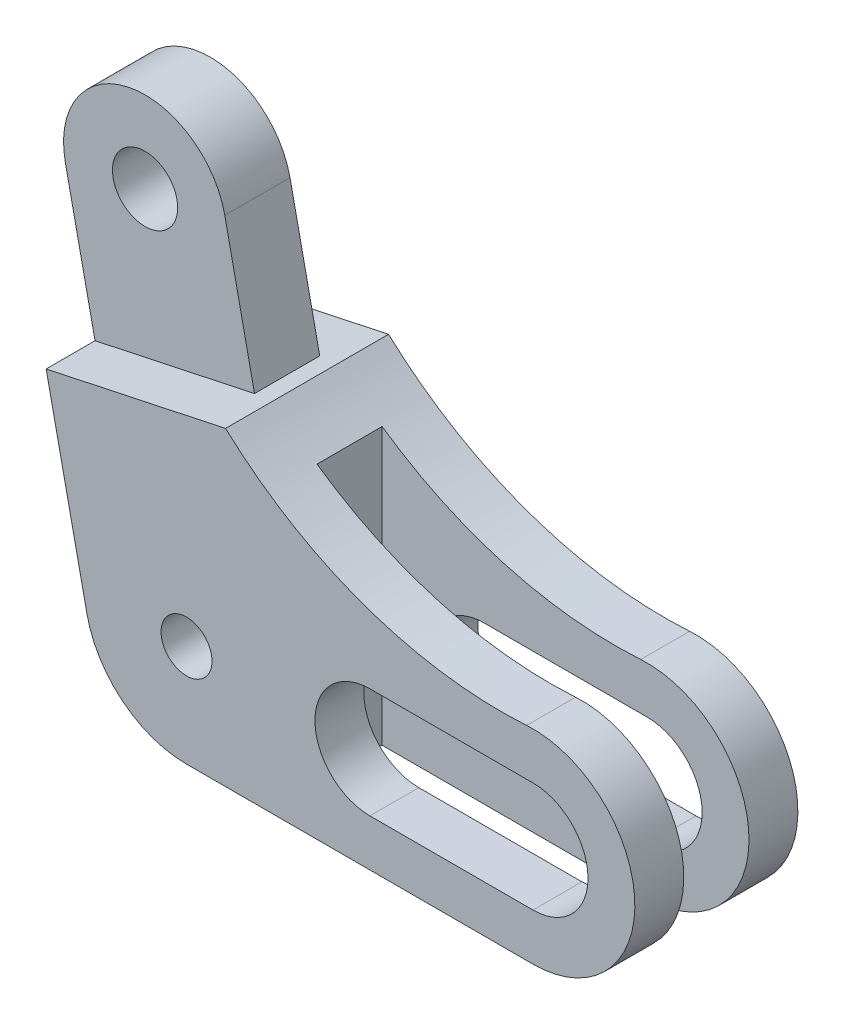
ISO-10303-21;
HEADER;
FILE_DESCRIPTION(('STEP AP214'),'2;1');
FILE_NAME('part.step','',(''),(''),'','','');
FILE_SCHEMA(('AUTOMOTIVE_DESIGN { 1 0 10303 214 1 1 1 1 }'));
ENDSEC;
DATA;
#1=APPLICATION_CONTEXT('core data for automotive mechanical design processes');
#2=APPLICATION_PROTOCOL_DEFINITION('international standard','automotive_design',2000,#1);
#3=PRODUCT_CONTEXT('',#1,'mechanical');
#4=PRODUCT('Part','Part','',(#3));
#5=PRODUCT_RELATED_PRODUCT_CATEGORY('part','',(#4));
#6=PRODUCT_DEFINITION_FORMATION('','',#4);
#7=PRODUCT_DEFINITION_CONTEXT('part definition',#1,'design');
#8=PRODUCT_DEFINITION('design','',#6,#7);
#9=PRODUCT_DEFINITION_SHAPE('','',#8);
#10=(LENGTH_UNIT() NAMED_UNIT(*) SI_UNIT(.MILLI.,.METRE.));
#11=(NAMED_UNIT(*) PLANE_ANGLE_UNIT() SI_UNIT($,.RADIAN.));
#12=(NAMED_UNIT(*) SI_UNIT($,.STERADIAN.) SOLID_ANGLE_UNIT());
#13=UNCERTAINTY_MEASURE_WITH_UNIT(LENGTH_MEASURE(1.E-05),#10,'distance_accuracy_value','');
#14=(GEOMETRIC_REPRESENTATION_CONTEXT(3) GLOBAL_UNCERTAINTY_ASSIGNED_CONTEXT((#13)) GLOBAL_UNIT_ASSIGNED_CONTEXT((#10,
#11,#12)) REPRESENTATION_CONTEXT('',''));
#15=CARTESIAN_POINT('',(0.,0.,0.));
#16=DIRECTION('',(0.,0.,1.));
#17=DIRECTION('',(1.,0.,0.));
#18=AXIS2_PLACEMENT_3D('',#15,#16,#17);
#19=CARTESIAN_POINT('',(85.,0.,20.));
#20=DIRECTION('',(0.,0.,-1.));
#21=DIRECTION('',(-1.,0.,0.));
#22=AXIS2_PLACEMENT_3D('',#19,#20,#21);
#23=CYLINDRICAL_SURFACE('',#22,25.);
#24=CARTESIAN_POINT('',(85.,0.,8.));
#25=DIRECTION('',(0.,0.,1.));
#26=DIRECTION('',(1.,0.,0.));
#27=AXIS2_PLACEMENT_3D('',#24,#25,#26);
#28=CIRCLE('',#27,25.);
#29=CARTESIAN_POINT('',(85.,-25.,8.));
#30=VERTEX_POINT('',#29);
#31=CARTESIAN_POINT('',(83.4431751405397,24.9514788410821,8.));
#32=VERTEX_POINT('',#31);
#33=EDGE_CURVE('E256',#30,#32,#28,.T.);
#34=ORIENTED_EDGE('',*,*,#33,.T.);
#35=DIRECTION('',(0.,0.,-1.));
#36=VECTOR('',#35,1.);
#37=CARTESIAN_POINT('',(83.4431751405397,24.9514788410821,20.));
#38=LINE('',#37,#36);
#39=CARTESIAN_POINT('',(83.4431751405397,24.9514788410821,20.));
#40=VERTEX_POINT('',#39);
#41=EDGE_CURVE('E338',#40,#32,#38,.T.);
#42=ORIENTED_EDGE('',*,*,#41,.F.);
#43=CARTESIAN_POINT('',(85.,0.,20.));
#44=DIRECTION('',(0.,0.,1.));
#45=DIRECTION('',(1.,0.,0.));
#46=AXIS2_PLACEMENT_3D('',#43,#44,#45);
#47=CIRCLE('',#46,25.);
#48=CARTESIAN_POINT('',(85.,-25.,20.));
#49=VERTEX_POINT('',#48);
#50=EDGE_CURVE('E308',#49,#40,#47,.T.);
#51=ORIENTED_EDGE('',*,*,#50,.F.);
#52=DIRECTION('',(0.,0.,-1.));
#53=VECTOR('',#52,1.);
#54=CARTESIAN_POINT('',(85.,-25.,20.));
#55=LINE('',#54,#53);
#56=EDGE_CURVE('E342',#49,#30,#55,.T.);
#57=ORIENTED_EDGE('',*,*,#56,.T.);
#58=EDGE_LOOP('',(#34,#42,#51,#57));
#59=FACE_BOUND('',#58,.T.);
#60=ADVANCED_FACE('F33',(#59),#23,.T.);
#61=CARTESIAN_POINT('',(85.,0.,20.));
#62=DIRECTION('',(0.,0.,-1.));
#63=DIRECTION('',(-1.,0.,0.));
#64=AXIS2_PLACEMENT_3D('',#61,#62,#63);
#65=CYLINDRICAL_SURFACE('',#64,13.5);
#66=CARTESIAN_POINT('',(85.,0.,8.));
#67=DIRECTION('',(0.,0.,1.));
#68=DIRECTION('',(1.,0.,0.));
#69=AXIS2_PLACEMENT_3D('',#66,#67,#68);
#70=CIRCLE('',#69,13.5);
#71=CARTESIAN_POINT('',(85.,-13.5,8.));
#72=VERTEX_POINT('',#71);
#73=CARTESIAN_POINT('',(85.,13.5,8.));
#74=VERTEX_POINT('',#73);
#75=EDGE_CURVE('E251',#72,#74,#70,.T.);
#76=ORIENTED_EDGE('',*,*,#75,.F.);
#77=DIRECTION('',(0.,0.,-1.));
#78=VECTOR('',#77,1.);
#79=CARTESIAN_POINT('',(85.,-13.5,20.));
#80=LINE('',#79,#78);
#81=CARTESIAN_POINT('',(85.,-13.5,20.));
#82=VERTEX_POINT('',#81);
#83=EDGE_CURVE('E286',#82,#72,#80,.T.);
#84=ORIENTED_EDGE('',*,*,#83,.F.);
#85=CARTESIAN_POINT('',(85.,0.,20.));
#86=DIRECTION('',(0.,0.,1.));
#87=DIRECTION('',(1.,0.,0.));
#88=AXIS2_PLACEMENT_3D('',#85,#86,#87);
#89=CIRCLE('',#88,13.5);
#90=CARTESIAN_POINT('',(85.,13.5,20.));
#91=VERTEX_POINT('',#90);
#92=EDGE_CURVE('E265',#82,#91,#89,.T.);
#93=ORIENTED_EDGE('',*,*,#92,.T.);
#94=DIRECTION('',(0.,0.,-1.));
#95=VECTOR('',#94,1.);
#96=CARTESIAN_POINT('',(85.,13.5,20.));
#97=LINE('',#96,#95);
#98=EDGE_CURVE('E298',#91,#74,#97,.T.);
#99=ORIENTED_EDGE('',*,*,#98,.T.);
#100=EDGE_LOOP('',(#76,#84,#93,#99));
#101=FACE_BOUND('',#100,.T.);
#102=ADVANCED_FACE('F359',(#101),#65,.F.);
#103=CARTESIAN_POINT('',(85.,13.5,20.));
#104=DIRECTION('',(0.,-1.,0.));
#105=DIRECTION('',(1.,0.,0.));
#106=AXIS2_PLACEMENT_3D('',#103,#104,#105);
#107=PLANE('',#106);
#108=DIRECTION('',(-1.,0.,0.));
#109=VECTOR('',#108,1.);
#110=CARTESIAN_POINT('',(85.,13.5,8.));
#111=LINE('',#110,#109);
#112=CARTESIAN_POINT('',(45.,13.5,7.99999999999999));
#113=VERTEX_POINT('',#112);
#114=EDGE_CURVE('E249',#74,#113,#111,.T.);
#115=ORIENTED_EDGE('',*,*,#114,.F.);
#116=ORIENTED_EDGE('',*,*,#98,.F.);
#117=DIRECTION('',(-1.,0.,0.));
#118=VECTOR('',#117,1.);
#119=CARTESIAN_POINT('',(85.,13.5,20.));
#120=LINE('',#119,#118);
#121=CARTESIAN_POINT('',(45.,13.5,20.));
#122=VERTEX_POINT('',#121);
#123=EDGE_CURVE('E267',#91,#122,#120,.T.);
#124=ORIENTED_EDGE('',*,*,#123,.T.);
#125=DIRECTION('',(0.,0.,-1.));
#126=VECTOR('',#125,1.);
#127=CARTESIAN_POINT('',(45.,13.5,20.));
#128=LINE('',#127,#126);
#129=EDGE_CURVE('E294',#122,#113,#128,.T.);
#130=ORIENTED_EDGE('',*,*,#129,.T.);
#131=EDGE_LOOP('',(#115,#116,#124,#130));
#132=FACE_BOUND('',#131,.T.);
#133=ADVANCED_FACE('F370',(#132),#107,.T.);
#134=CARTESIAN_POINT('',(45.,0.,20.));
#135=DIRECTION('',(0.,0.,-1.));
#136=DIRECTION('',(-1.,0.,0.));
#137=AXIS2_PLACEMENT_3D('',#134,#135,#136);
#138=CYLINDRICAL_SURFACE('',#137,13.5);
#139=CARTESIAN_POINT('',(45.,0.,7.99999999999999));
#140=DIRECTION('',(0.,0.,1.));
#141=DIRECTION('',(1.,0.,0.));
#142=AXIS2_PLACEMENT_3D('',#139,#140,#141);
#143=CIRCLE('',#142,13.5);
#144=CARTESIAN_POINT('',(45.,-13.5,8.));
#145=VERTEX_POINT('',#144);
#146=EDGE_CURVE('E247',#113,#145,#143,.T.);
#147=ORIENTED_EDGE('',*,*,#146,.F.);
#148=ORIENTED_EDGE('',*,*,#129,.F.);
#149=CARTESIAN_POINT('',(45.,0.,20.));
#150=DIRECTION('',(0.,0.,1.));
#151=DIRECTION('',(1.,0.,0.));
#152=AXIS2_PLACEMENT_3D('',#149,#150,#151);
#153=CIRCLE('',#152,13.5);
#154=CARTESIAN_POINT('',(45.,-13.5,20.));
#155=VERTEX_POINT('',#154);
#156=EDGE_CURVE('E270',#122,#155,#153,.T.);
#157=ORIENTED_EDGE('',*,*,#156,.T.);
#158=DIRECTION('',(0.,0.,-1.));
#159=VECTOR('',#158,1.);
#160=CARTESIAN_POINT('',(45.,-13.5,20.));
#161=LINE('',#160,#159);
#162=EDGE_CURVE('E290',#155,#145,#161,.T.);
#163=ORIENTED_EDGE('',*,*,#162,.T.);
#164=EDGE_LOOP('',(#147,#148,#157,#163));
#165=FACE_BOUND('',#164,.T.);
#166=ADVANCED_FACE('F373',(#165),#138,.F.);
#167=CARTESIAN_POINT('',(85.,-13.5,20.));
#168=DIRECTION('',(0.,1.,0.));
#169=DIRECTION('',(-1.,0.,0.));
#170=AXIS2_PLACEMENT_3D('',#167,#168,#169);
#171=PLANE('',#170);
#172=DIRECTION('',(1.,0.,0.));
#173=VECTOR('',#172,1.);
#174=CARTESIAN_POINT('',(85.,-13.5,8.));
#175=LINE('',#174,#173);
#176=EDGE_CURVE('E41',#145,#72,#175,.T.);
#177=ORIENTED_EDGE('',*,*,#176,.F.);
#178=ORIENTED_EDGE('',*,*,#162,.F.);
#179=DIRECTION('',(1.,0.,0.));
#180=VECTOR('',#179,1.);
#181=CARTESIAN_POINT('',(85.,-13.5,20.));
#182=LINE('',#181,#180);
#183=EDGE_CURVE('E273',#155,#82,#182,.T.);
#184=ORIENTED_EDGE('',*,*,#183,.T.);
#185=ORIENTED_EDGE('',*,*,#83,.T.);
#186=EDGE_LOOP('',(#177,#178,#184,#185));
#187=FACE_BOUND('',#186,.T.);
#188=ADVANCED_FACE('F362',(#187),#171,.T.);
#189=CARTESIAN_POINT('',(0.,0.,20.));
#190=DIRECTION('',(0.,0.,1.));
#191=DIRECTION('',(1.,0.,0.));
#192=AXIS2_PLACEMENT_3D('',#189,#190,#191);
#193=PLANE('',#192);
#194=ORIENTED_EDGE('',*,*,#123,.F.);
#195=ORIENTED_EDGE('',*,*,#92,.F.);
#196=ORIENTED_EDGE('',*,*,#183,.F.);
#197=ORIENTED_EDGE('',*,*,#156,.F.);
#198=EDGE_LOOP('',(#194,#195,#196,#197));
#199=FACE_BOUND('',#198,.T.);
#200=CARTESIAN_POINT('',(0.,0.,20.));
#201=DIRECTION('',(0.,0.,1.));
#202=DIRECTION('',(1.,0.,0.));
#203=AXIS2_PLACEMENT_3D('',#200,#201,#202);
#204=CIRCLE('',#203,25.);
#205=CARTESIAN_POINT('',(-24.4520069263471,-5.20570430142507,20.));
#206=VERTEX_POINT('',#205);
#207=CARTESIAN_POINT('',(0.,-25.,20.));
#208=VERTEX_POINT('',#207);
#209=EDGE_CURVE('E302',#206,#208,#204,.T.);
#210=ORIENTED_EDGE('',*,*,#209,.T.);
#211=DIRECTION('',(1.,0.,0.));
#212=VECTOR('',#211,1.);
#213=CARTESIAN_POINT('',(0.,-25.,20.));
#214=LINE('',#213,#212);
#215=EDGE_CURVE('E305',#208,#49,#214,.T.);
#216=ORIENTED_EDGE('',*,*,#215,.T.);
#217=ORIENTED_EDGE('',*,*,#50,.T.);
#218=CARTESIAN_POINT('',(77.2158757026983,124.75739420541,20.));
#219=DIRECTION('',(0.,0.,-1.));
#220=DIRECTION('',(-1.,0.,0.));
#221=AXIS2_PLACEMENT_3D('',#218,#219,#220);
#222=CIRCLE('',#221,100.);
#223=CARTESIAN_POINT('',(9.56665328234152,51.1124167397264,20.));
#224=VERTEX_POINT('',#223);
#225=EDGE_CURVE('E310',#40,#224,#222,.T.);
#226=ORIENTED_EDGE('',*,*,#225,.T.);
#227=DIRECTION('',(-0.978080277053882,-0.208228172057003,0.));
#228=VECTOR('',#227,1.);
#229=CARTESIAN_POINT('',(9.5666532823415,51.1124167397264,20.));
#230=LINE('',#229,#228);
#231=CARTESIAN_POINT('',(-34.4469591850832,41.7421489971613,20.));
#232=VERTEX_POINT('',#231);
#233=EDGE_CURVE('E312',#224,#232,#230,.T.);
#234=ORIENTED_EDGE('',*,*,#233,.T.);
#235=DIRECTION('',(0.208228172057003,-0.978080277053882,0.));
#236=VECTOR('',#235,1.);
#237=CARTESIAN_POINT('',(-34.4469591850832,41.7421489971613,20.));
#238=LINE('',#237,#236);
#239=EDGE_CURVE('E314',#232,#206,#238,.T.);
#240=ORIENTED_EDGE('',*,*,#239,.T.);
#241=EDGE_LOOP('',(#210,#216,#217,#226,#234,#240));
#242=FACE_BOUND('',#241,.T.);
#243=CARTESIAN_POINT('',(0.,0.,20.));
#244=DIRECTION('',(0.,0.,1.));
#245=DIRECTION('',(1.,0.,0.));
#246=AXIS2_PLACEMENT_3D('',#243,#244,#245);
#247=CIRCLE('',#246,6.25);
#248=CARTESIAN_POINT('',(6.25,0.,20.));
#249=VERTEX_POINT('',#248);
#250=EDGE_CURVE('E259',#249,#249,#247,.T.);
#251=ORIENTED_EDGE('',*,*,#250,.F.);
#252=EDGE_LOOP('',(#251));
#253=FACE_BOUND('',#252,.T.);
#254=ADVANCED_FACE('F367',(#199,#242,#253),#193,.T.);
#255=CARTESIAN_POINT('',(0.,0.,-20.));
#256=DIRECTION('',(0.,0.,1.));
#257=DIRECTION('',(1.,0.,0.));
#258=AXIS2_PLACEMENT_3D('',#255,#256,#257);
#259=PLANE('',#258);
#260=CARTESIAN_POINT('',(0.,0.,-20.));
#261=DIRECTION('',(0.,0.,1.));
#262=DIRECTION('',(1.,0.,0.));
#263=AXIS2_PLACEMENT_3D('',#260,#261,#262);
#264=CIRCLE('',#263,25.);
#265=CARTESIAN_POINT('',(-24.4520069263471,-5.20570430142507,-20.));
#266=VERTEX_POINT('',#265);
#267=CARTESIAN_POINT('',(0.,-25.,-20.));
#268=VERTEX_POINT('',#267);
#269=EDGE_CURVE('E301',#266,#268,#264,.T.);
#270=ORIENTED_EDGE('',*,*,#269,.F.);
#271=DIRECTION('',(0.208228172057003,-0.978080277053882,0.));
#272=VECTOR('',#271,1.);
#273=CARTESIAN_POINT('',(-34.4469591850832,41.7421489971613,-20.));
#274=LINE('',#273,#272);
#275=CARTESIAN_POINT('',(-34.4469591850832,41.7421489971613,-20.));
#276=VERTEX_POINT('',#275);
#277=EDGE_CURVE('E306',#276,#266,#274,.T.);
#278=ORIENTED_EDGE('',*,*,#277,.F.);
#279=DIRECTION('',(-0.978080277053882,-0.208228172057003,0.));
#280=VECTOR('',#279,1.);
#281=CARTESIAN_POINT('',(9.5666532823415,51.1124167397264,-20.));
#282=LINE('',#281,#280);
#283=CARTESIAN_POINT('',(9.56665328234152,51.1124167397264,-20.));
#284=VERTEX_POINT('',#283);
#285=EDGE_CURVE('E327',#284,#276,#282,.T.);
#286=ORIENTED_EDGE('',*,*,#285,.F.);
#287=CARTESIAN_POINT('',(77.2158757026983,124.75739420541,-20.));
#288=DIRECTION('',(0.,0.,-1.));
#289=DIRECTION('',(-1.,0.,0.));
#290=AXIS2_PLACEMENT_3D('',#287,#288,#289);
#291=CIRCLE('',#290,100.);
#292=CARTESIAN_POINT('',(83.4431751405397,24.9514788410821,-20.));
#293=VERTEX_POINT('',#292);
#294=EDGE_CURVE('E325',#293,#284,#291,.T.);
#295=ORIENTED_EDGE('',*,*,#294,.F.);
#296=CARTESIAN_POINT('',(85.,0.,-20.));
#297=DIRECTION('',(0.,0.,1.));
#298=DIRECTION('',(1.,0.,0.));
#299=AXIS2_PLACEMENT_3D('',#296,#297,#298);
#300=CIRCLE('',#299,25.);
#301=CARTESIAN_POINT('',(85.,-25.,-20.));
#302=VERTEX_POINT('',#301);
#303=EDGE_CURVE('E322',#302,#293,#300,.T.);
#304=ORIENTED_EDGE('',*,*,#303,.F.);
#305=DIRECTION('',(1.,0.,0.));
#306=VECTOR('',#305,1.);
#307=CARTESIAN_POINT('',(0.,-25.,-20.));
#308=LINE('',#307,#306);
#309=EDGE_CURVE('E319',#268,#302,#308,.T.);
#310=ORIENTED_EDGE('',*,*,#309,.F.);
#311=EDGE_LOOP('',(#270,#278,#286,#295,#304,#310));
#312=FACE_BOUND('',#311,.T.);
#313=CARTESIAN_POINT('',(85.,0.,-20.));
#314=DIRECTION('',(0.,0.,1.));
#315=DIRECTION('',(1.,0.,0.));
#316=AXIS2_PLACEMENT_3D('',#313,#314,#315);
#317=CIRCLE('',#316,13.5);
#318=CARTESIAN_POINT('',(85.,-13.5,-20.));
#319=VERTEX_POINT('',#318);
#320=CARTESIAN_POINT('',(85.,13.5,-20.));
#321=VERTEX_POINT('',#320);
#322=EDGE_CURVE('E262',#319,#321,#317,.T.);
#323=ORIENTED_EDGE('',*,*,#322,.T.);
#324=DIRECTION('',(-1.,0.,0.));
#325=VECTOR('',#324,1.);
#326=CARTESIAN_POINT('',(85.,13.5,-20.));
#327=LINE('',#326,#325);
#328=CARTESIAN_POINT('',(45.,13.5,-20.));
#329=VERTEX_POINT('',#328);
#330=EDGE_CURVE('E278',#321,#329,#327,.T.);
#331=ORIENTED_EDGE('',*,*,#330,.T.);
#332=CARTESIAN_POINT('',(45.,0.,-20.));
#333=DIRECTION('',(0.,0.,1.));
#334=DIRECTION('',(1.,0.,0.));
#335=AXIS2_PLACEMENT_3D('',#332,#333,#334);
#336=CIRCLE('',#335,13.5);
#337=CARTESIAN_POINT('',(45.,-13.5,-20.));
#338=VERTEX_POINT('',#337);
#339=EDGE_CURVE('E281',#329,#338,#336,.T.);
#340=ORIENTED_EDGE('',*,*,#339,.T.);
#341=DIRECTION('',(1.,0.,0.));
#342=VECTOR('',#341,1.);
#343=CARTESIAN_POINT('',(85.,-13.5,-20.));
#344=LINE('',#343,#342);
#345=EDGE_CURVE('E268',#338,#319,#344,.T.);
#346=ORIENTED_EDGE('',*,*,#345,.T.);
#347=EDGE_LOOP('',(#323,#331,#340,#346));
#348=FACE_BOUND('',#347,.T.);
#349=CARTESIAN_POINT('',(0.,0.,-20.));
#350=DIRECTION('',(0.,0.,1.));
#351=DIRECTION('',(1.,0.,0.));
#352=AXIS2_PLACEMENT_3D('',#349,#350,#351);
#353=CIRCLE('',#352,6.25);
#354=CARTESIAN_POINT('',(6.25,0.,-20.));
#355=VERTEX_POINT('',#354);
#356=EDGE_CURVE('E258',#355,#355,#353,.T.);
#357=ORIENTED_EDGE('',*,*,#356,.T.);
#358=EDGE_LOOP('',(#357));
#359=FACE_BOUND('',#358,.T.);
#360=ADVANCED_FACE('F418',(#312,#348,#359),#259,.F.);
#361=CARTESIAN_POINT('',(0.,0.,20.));
#362=DIRECTION('',(0.,0.,-1.));
#363=DIRECTION('',(-1.,0.,0.));
#364=AXIS2_PLACEMENT_3D('',#361,#362,#363);
#365=CYLINDRICAL_SURFACE('',#364,25.);
#366=ORIENTED_EDGE('',*,*,#269,.T.);
#367=DIRECTION('',(0.,0.,-1.));
#368=VECTOR('',#367,1.);
#369=CARTESIAN_POINT('',(0.,-25.,20.));
#370=LINE('',#369,#368);
#371=EDGE_CURVE('E345',#208,#268,#370,.T.);
#372=ORIENTED_EDGE('',*,*,#371,.F.);
#373=ORIENTED_EDGE('',*,*,#209,.F.);
#374=DIRECTION('',(0.,0.,-1.));
#375=VECTOR('',#374,1.);
#376=CARTESIAN_POINT('',(-24.4520069263471,-5.20570430142507,20.));
#377=LINE('',#376,#375);
#378=EDGE_CURVE('E316',#206,#266,#377,.T.);
#379=ORIENTED_EDGE('',*,*,#378,.T.);
#380=EDGE_LOOP('',(#366,#372,#373,#379));
#381=FACE_BOUND('',#380,.T.);
#382=ADVANCED_FACE('F35',(#381),#365,.T.);
#383=CARTESIAN_POINT('',(0.,-25.,20.));
#384=DIRECTION('',(0.,1.,0.));
#385=DIRECTION('',(-1.,0.,0.));
#386=AXIS2_PLACEMENT_3D('',#383,#384,#385);
#387=PLANE('',#386);
#388=DIRECTION('',(0.,0.,1.));
#389=VECTOR('',#388,1.);
#390=CARTESIAN_POINT('',(20.,-25.,-7.99999999999999));
#391=LINE('',#390,#389);
#392=CARTESIAN_POINT('',(20.,-25.,-7.99999999999999));
#393=VERTEX_POINT('',#392);
#394=CARTESIAN_POINT('',(20.,-25.,7.99999999999999));
#395=VERTEX_POINT('',#394);
#396=EDGE_CURVE('E224',#393,#395,#391,.T.);
#397=ORIENTED_EDGE('',*,*,#396,.T.);
#398=DIRECTION('',(1.,0.,0.));
#399=VECTOR('',#398,1.);
#400=CARTESIAN_POINT('',(110.,-25.,8.));
#401=LINE('',#400,#399);
#402=EDGE_CURVE('E227',#395,#30,#401,.T.);
#403=ORIENTED_EDGE('',*,*,#402,.T.);
#404=ORIENTED_EDGE('',*,*,#56,.F.);
#405=ORIENTED_EDGE('',*,*,#215,.F.);
#406=ORIENTED_EDGE('',*,*,#371,.T.);
#407=ORIENTED_EDGE('',*,*,#309,.T.);
#408=CARTESIAN_POINT('',(85.,-25.,-8.));
#409=VERTEX_POINT('',#408);
#410=EDGE_CURVE('E341',#409,#302,#55,.T.);
#411=ORIENTED_EDGE('',*,*,#410,.F.);
#412=DIRECTION('',(-1.,0.,0.));
#413=VECTOR('',#412,1.);
#414=CARTESIAN_POINT('',(110.,-25.,-8.));
#415=LINE('',#414,#413);
#416=EDGE_CURVE('E187',#409,#393,#415,.T.);
#417=ORIENTED_EDGE('',*,*,#416,.T.);
#418=EDGE_LOOP('',(#397,#403,#404,#405,#406,#407,#411,#417));
#419=FACE_BOUND('',#418,.T.);
#420=ADVANCED_FACE('F399',(#419),#387,.F.);
#421=CARTESIAN_POINT('',(85.,0.,-8.));
#422=DIRECTION('',(0.,0.,-1.));
#423=DIRECTION('',(-1.,0.,0.));
#424=AXIS2_PLACEMENT_3D('',#421,#422,#423);
#425=CIRCLE('',#424,25.);
#426=CARTESIAN_POINT('',(83.4431751405397,24.9514788410821,-7.99999999999999));
#427=VERTEX_POINT('',#426);
#428=EDGE_CURVE('E245',#427,#409,#425,.T.);
#429=ORIENTED_EDGE('',*,*,#428,.T.);
#430=ORIENTED_EDGE('',*,*,#410,.T.);
#431=ORIENTED_EDGE('',*,*,#303,.T.);
#432=EDGE_CURVE('E337',#427,#293,#38,.T.);
#433=ORIENTED_EDGE('',*,*,#432,.F.);
#434=EDGE_LOOP('',(#429,#430,#431,#433));
#435=FACE_BOUND('',#434,.T.);
#436=ADVANCED_FACE('F390',(#435),#23,.T.);
#437=CARTESIAN_POINT('',(77.2158757026983,124.75739420541,20.));
#438=DIRECTION('',(0.,0.,-1.));
#439=DIRECTION('',(-1.,0.,0.));
#440=AXIS2_PLACEMENT_3D('',#437,#438,#439);
#441=CYLINDRICAL_SURFACE('',#440,100.);
#442=ORIENTED_EDGE('',*,*,#41,.T.);
#443=CARTESIAN_POINT('',(77.2158757026983,124.75739420541,8.));
#444=DIRECTION('',(0.,0.,1.));
#445=DIRECTION('',(1.,0.,0.));
#446=AXIS2_PLACEMENT_3D('',#443,#444,#445);
#447=CIRCLE('',#446,100.);
#448=CARTESIAN_POINT('',(20.,42.7431054041693,7.99999999999999));
#449=VERTEX_POINT('',#448);
#450=EDGE_CURVE('E253',#32,#449,#447,.F.);
#451=ORIENTED_EDGE('',*,*,#450,.T.);
#452=DIRECTION('',(0.,0.,-1.));
#453=VECTOR('',#452,1.);
#454=CARTESIAN_POINT('',(20.,42.7431054041693,20.));
#455=LINE('',#454,#453);
#456=CARTESIAN_POINT('',(20.,42.7431054041693,-7.99999999999999));
#457=VERTEX_POINT('',#456);
#458=EDGE_CURVE('E11',#449,#457,#455,.T.);
#459=ORIENTED_EDGE('',*,*,#458,.T.);
#460=CARTESIAN_POINT('',(77.2158757026983,124.75739420541,-8.));
#461=DIRECTION('',(0.,0.,-1.));
#462=DIRECTION('',(-1.,0.,0.));
#463=AXIS2_PLACEMENT_3D('',#460,#461,#462);
#464=CIRCLE('',#463,100.);
#465=EDGE_CURVE('E242',#457,#427,#464,.F.);
#466=ORIENTED_EDGE('',*,*,#465,.T.);
#467=ORIENTED_EDGE('',*,*,#432,.T.);
#468=ORIENTED_EDGE('',*,*,#294,.T.);
#469=DIRECTION('',(0.,0.,-1.));
#470=VECTOR('',#469,1.);
#471=CARTESIAN_POINT('',(9.56665328234152,51.1124167397264,20.));
#472=LINE('',#471,#470);
#473=EDGE_CURVE('E334',#224,#284,#472,.T.);
#474=ORIENTED_EDGE('',*,*,#473,.F.);
#475=ORIENTED_EDGE('',*,*,#225,.F.);
#476=EDGE_LOOP('',(#442,#451,#459,#466,#467,#468,#474,#475));
#477=FACE_BOUND('',#476,.T.);
#478=ADVANCED_FACE('F398',(#477),#441,.F.);
#479=CARTESIAN_POINT('',(9.5666532823415,51.1124167397264,20.));
#480=DIRECTION('',(0.208228172057003,-0.978080277053882,0.));
#481=DIRECTION('',(0.978080277053882,0.208228172057003,0.));
#482=AXIS2_PLACEMENT_3D('',#479,#480,#481);
#483=PLANE('',#482);
#484=DIRECTION('',(0.,0.,-1.));
#485=VECTOR('',#484,1.);
#486=CARTESIAN_POINT('',(-34.4469591850832,41.7421489971613,20.));
#487=LINE('',#486,#485);
#488=CARTESIAN_POINT('',(-34.4469591850832,41.7421489971613,-8.));
#489=VERTEX_POINT('',#488);
#490=EDGE_CURVE('E53',#489,#276,#487,.T.);
#491=ORIENTED_EDGE('',*,*,#490,.F.);
#492=DIRECTION('',(0.978080277053882,0.208228172057002,0.));
#493=VECTOR('',#492,1.);
#494=CARTESIAN_POINT('',(4.67625189707213,50.0712758794414,-8.));
#495=LINE('',#494,#493);
#496=CARTESIAN_POINT('',(4.67625189707213,50.0712758794414,-8.));
#497=VERTEX_POINT('',#496);
#498=EDGE_CURVE('E48',#489,#497,#495,.T.);
#499=ORIENTED_EDGE('',*,*,#498,.T.);
#500=DIRECTION('',(0.,0.,-1.));
#501=VECTOR('',#500,1.);
#502=CARTESIAN_POINT('',(4.67625189707213,50.0712758794414,8.));
#503=LINE('',#502,#501);
#504=CARTESIAN_POINT('',(4.67625189707213,50.0712758794414,8.));
#505=VERTEX_POINT('',#504);
#506=EDGE_CURVE('E179',#505,#497,#503,.T.);
#507=ORIENTED_EDGE('',*,*,#506,.F.);
#508=DIRECTION('',(0.978080277053882,0.208228172057002,0.));
#509=VECTOR('',#508,1.);
#510=CARTESIAN_POINT('',(4.67625189707213,50.0712758794414,8.));
#511=LINE('',#510,#509);
#512=CARTESIAN_POINT('',(-34.4469591850832,41.7421489971613,8.));
#513=VERTEX_POINT('',#512);
#514=EDGE_CURVE('E184',#513,#505,#511,.T.);
#515=ORIENTED_EDGE('',*,*,#514,.F.);
#516=EDGE_CURVE('E332',#232,#513,#487,.T.);
#517=ORIENTED_EDGE('',*,*,#516,.F.);
#518=ORIENTED_EDGE('',*,*,#233,.F.);
#519=ORIENTED_EDGE('',*,*,#473,.T.);
#520=ORIENTED_EDGE('',*,*,#285,.T.);
#521=EDGE_LOOP('',(#491,#499,#507,#515,#517,#518,#519,#520));
#522=FACE_BOUND('',#521,.T.);
#523=ADVANCED_FACE('F181',(#522),#483,.F.);
#524=CARTESIAN_POINT('',(-34.4469591850832,41.7421489971613,20.));
#525=DIRECTION('',(0.978080277053882,0.208228172057003,0.));
#526=DIRECTION('',(-0.208228172057003,0.978080277053882,0.));
#527=AXIS2_PLACEMENT_3D('',#524,#525,#526);
#528=PLANE('',#527);
#529=ORIENTED_EDGE('',*,*,#277,.T.);
#530=ORIENTED_EDGE('',*,*,#378,.F.);
#531=ORIENTED_EDGE('',*,*,#239,.F.);
#532=ORIENTED_EDGE('',*,*,#516,.T.);
#533=DIRECTION('',(0.208228172057002,-0.978080277053883,0.));
#534=VECTOR('',#533,1.);
#535=CARTESIAN_POINT('',(-34.4469591850832,41.7421489971613,8.));
#536=LINE('',#535,#534);
#537=CARTESIAN_POINT('',(-41.7349452070783,75.9749586940472,8.));
#538=VERTEX_POINT('',#537);
#539=EDGE_CURVE('E202',#538,#513,#536,.T.);
#540=ORIENTED_EDGE('',*,*,#539,.F.);
#541=DIRECTION('',(0.,0.,-1.));
#542=VECTOR('',#541,1.);
#543=CARTESIAN_POINT('',(-41.7349452070783,75.9749586940472,8.));
#544=LINE('',#543,#542);
#545=CARTESIAN_POINT('',(-41.7349452070783,75.9749586940472,-8.));
#546=VERTEX_POINT('',#545);
#547=EDGE_CURVE('E213',#538,#546,#544,.T.);
#548=ORIENTED_EDGE('',*,*,#547,.T.);
#549=DIRECTION('',(0.208228172057002,-0.978080277053883,0.));
#550=VECTOR('',#549,1.);
#551=CARTESIAN_POINT('',(-34.4469591850832,41.7421489971613,-8.));
#552=LINE('',#551,#550);
#553=EDGE_CURVE('E203',#546,#489,#552,.T.);
#554=ORIENTED_EDGE('',*,*,#553,.T.);
#555=ORIENTED_EDGE('',*,*,#490,.T.);
#556=EDGE_LOOP('',(#529,#530,#531,#532,#540,#548,#554,#555));
#557=FACE_BOUND('',#556,.T.);
#558=ADVANCED_FACE('F438',(#557),#528,.F.);
#559=CARTESIAN_POINT('',(85.,0.,-8.));
#560=DIRECTION('',(0.,0.,-1.));
#561=DIRECTION('',(-1.,0.,0.));
#562=AXIS2_PLACEMENT_3D('',#559,#560,#561);
#563=CIRCLE('',#562,13.5);
#564=CARTESIAN_POINT('',(85.,13.5,-8.));
#565=VERTEX_POINT('',#564);
#566=CARTESIAN_POINT('',(85.,-13.5,-8.));
#567=VERTEX_POINT('',#566);
#568=EDGE_CURVE('E240',#565,#567,#563,.T.);
#569=ORIENTED_EDGE('',*,*,#568,.F.);
#570=EDGE_CURVE('E297',#565,#321,#97,.T.);
#571=ORIENTED_EDGE('',*,*,#570,.T.);
#572=ORIENTED_EDGE('',*,*,#322,.F.);
#573=EDGE_CURVE('E275',#567,#319,#80,.T.);
#574=ORIENTED_EDGE('',*,*,#573,.F.);
#575=EDGE_LOOP('',(#569,#571,#572,#574));
#576=FACE_BOUND('',#575,.T.);
#577=ADVANCED_FACE('F395',(#576),#65,.F.);
#578=DIRECTION('',(1.,0.,0.));
#579=VECTOR('',#578,1.);
#580=CARTESIAN_POINT('',(85.,13.5,-8.));
#581=LINE('',#580,#579);
#582=CARTESIAN_POINT('',(45.,13.5,-7.99999999999999));
#583=VERTEX_POINT('',#582);
#584=EDGE_CURVE('E238',#583,#565,#581,.T.);
#585=ORIENTED_EDGE('',*,*,#584,.F.);
#586=EDGE_CURVE('E293',#583,#329,#128,.T.);
#587=ORIENTED_EDGE('',*,*,#586,.T.);
#588=ORIENTED_EDGE('',*,*,#330,.F.);
#589=ORIENTED_EDGE('',*,*,#570,.F.);
#590=EDGE_LOOP('',(#585,#587,#588,#589));
#591=FACE_BOUND('',#590,.T.);
#592=ADVANCED_FACE('F384',(#591),#107,.T.);
#593=CARTESIAN_POINT('',(45.,0.,-7.99999999999999));
#594=DIRECTION('',(0.,0.,-1.));
#595=DIRECTION('',(-1.,0.,0.));
#596=AXIS2_PLACEMENT_3D('',#593,#594,#595);
#597=CIRCLE('',#596,13.5);
#598=CARTESIAN_POINT('',(45.,-13.5,-7.99999999999999));
#599=VERTEX_POINT('',#598);
#600=EDGE_CURVE('E234',#599,#583,#597,.T.);
#601=ORIENTED_EDGE('',*,*,#600,.F.);
#602=EDGE_CURVE('E289',#599,#338,#161,.T.);
#603=ORIENTED_EDGE('',*,*,#602,.T.);
#604=ORIENTED_EDGE('',*,*,#339,.F.);
#605=ORIENTED_EDGE('',*,*,#586,.F.);
#606=EDGE_LOOP('',(#601,#603,#604,#605));
#607=FACE_BOUND('',#606,.T.);
#608=ADVANCED_FACE('F376',(#607),#138,.F.);
#609=DIRECTION('',(-1.,0.,0.));
#610=VECTOR('',#609,1.);
#611=CARTESIAN_POINT('',(85.,-13.5,-8.));
#612=LINE('',#611,#610);
#613=EDGE_CURVE('E348',#567,#599,#612,.T.);
#614=ORIENTED_EDGE('',*,*,#613,.F.);
#615=ORIENTED_EDGE('',*,*,#573,.T.);
#616=ORIENTED_EDGE('',*,*,#345,.F.);
#617=ORIENTED_EDGE('',*,*,#602,.F.);
#618=EDGE_LOOP('',(#614,#615,#616,#617));
#619=FACE_BOUND('',#618,.T.);
#620=ADVANCED_FACE('F382',(#619),#171,.T.);
#621=CARTESIAN_POINT('',(0.,0.,20.));
#622=DIRECTION('',(0.,0.,-1.));
#623=DIRECTION('',(-1.,0.,0.));
#624=AXIS2_PLACEMENT_3D('',#621,#622,#623);
#625=CYLINDRICAL_SURFACE('',#624,6.25);
#626=ORIENTED_EDGE('',*,*,#250,.T.);
#627=EDGE_LOOP('',(#626));
#628=FACE_BOUND('',#627,.T.);
#629=ORIENTED_EDGE('',*,*,#356,.F.);
#630=EDGE_LOOP('',(#629));
#631=FACE_BOUND('',#630,.T.);
#632=ADVANCED_FACE('F464',(#628,#631),#625,.F.);
#633=CARTESIAN_POINT('',(20.,-25.,-7.99999999999999));
#634=DIRECTION('',(-1.,0.,0.));
#635=DIRECTION('',(0.,0.,1.));
#636=AXIS2_PLACEMENT_3D('',#633,#634,#635);
#637=PLANE('',#636);
#638=DIRECTION('',(0.,1.,0.));
#639=VECTOR('',#638,1.);
#640=CARTESIAN_POINT('',(20.,-25.,7.99999999999999));
#641=LINE('',#640,#639);
#642=EDGE_CURVE('E231',#395,#449,#641,.T.);
#643=ORIENTED_EDGE('',*,*,#642,.F.);
#644=ORIENTED_EDGE('',*,*,#396,.F.);
#645=DIRECTION('',(0.,1.,0.));
#646=VECTOR('',#645,1.);
#647=CARTESIAN_POINT('',(20.,-25.,-7.99999999999999));
#648=LINE('',#647,#646);
#649=EDGE_CURVE('E230',#393,#457,#648,.T.);
#650=ORIENTED_EDGE('',*,*,#649,.T.);
#651=ORIENTED_EDGE('',*,*,#458,.F.);
#652=EDGE_LOOP('',(#643,#644,#650,#651));
#653=FACE_BOUND('',#652,.T.);
#654=ADVANCED_FACE('F434',(#653),#637,.F.);
#655=CARTESIAN_POINT('',(110.,-25.,8.));
#656=DIRECTION('',(0.,0.,1.));
#657=DIRECTION('',(1.,0.,0.));
#658=AXIS2_PLACEMENT_3D('',#655,#656,#657);
#659=PLANE('',#658);
#660=ORIENTED_EDGE('',*,*,#75,.T.);
#661=ORIENTED_EDGE('',*,*,#114,.T.);
#662=ORIENTED_EDGE('',*,*,#146,.T.);
#663=ORIENTED_EDGE('',*,*,#176,.T.);
#664=EDGE_LOOP('',(#660,#661,#662,#663));
#665=FACE_BOUND('',#664,.T.);
#666=ORIENTED_EDGE('',*,*,#402,.F.);
#667=ORIENTED_EDGE('',*,*,#642,.T.);
#668=ORIENTED_EDGE('',*,*,#450,.F.);
#669=ORIENTED_EDGE('',*,*,#33,.F.);
#670=EDGE_LOOP('',(#666,#667,#668,#669));
#671=FACE_BOUND('',#670,.T.);
#672=ADVANCED_FACE('F352',(#665,#671),#659,.F.);
#673=CARTESIAN_POINT('',(110.,-25.,-8.));
#674=DIRECTION('',(0.,0.,-1.));
#675=DIRECTION('',(-1.,0.,0.));
#676=AXIS2_PLACEMENT_3D('',#673,#674,#675);
#677=PLANE('',#676);
#678=ORIENTED_EDGE('',*,*,#568,.T.);
#679=ORIENTED_EDGE('',*,*,#613,.T.);
#680=ORIENTED_EDGE('',*,*,#600,.T.);
#681=ORIENTED_EDGE('',*,*,#584,.T.);
#682=EDGE_LOOP('',(#678,#679,#680,#681));
#683=FACE_BOUND('',#682,.T.);
#684=ORIENTED_EDGE('',*,*,#428,.F.);
#685=ORIENTED_EDGE('',*,*,#465,.F.);
#686=ORIENTED_EDGE('',*,*,#649,.F.);
#687=ORIENTED_EDGE('',*,*,#416,.F.);
#688=EDGE_LOOP('',(#684,#685,#686,#687));
#689=FACE_BOUND('',#688,.T.);
#690=ADVANCED_FACE('F411',(#683,#689),#677,.F.);
#691=CARTESIAN_POINT('',(-22.1733396660006,80.1395221351872,8.));
#692=DIRECTION('',(0.,0.,-1.));
#693=DIRECTION('',(-1.,0.,0.));
#694=AXIS2_PLACEMENT_3D('',#691,#692,#693);
#695=PLANE('',#694);
#696=ORIENTED_EDGE('',*,*,#514,.T.);
#697=DIRECTION('',(-0.208228172057003,0.978080277053882,0.));
#698=VECTOR('',#697,1.);
#699=CARTESIAN_POINT('',(-2.61173412492297,84.3040855763273,8.));
#700=LINE('',#699,#698);
#701=CARTESIAN_POINT('',(-2.61173412492296,84.3040855763273,8.));
#702=VERTEX_POINT('',#701);
#703=EDGE_CURVE('E191',#505,#702,#700,.T.);
#704=ORIENTED_EDGE('',*,*,#703,.T.);
#705=CARTESIAN_POINT('',(-22.1733396660006,80.1395221351872,8.));
#706=DIRECTION('',(0.,0.,1.));
#707=DIRECTION('',(-1.,0.,0.));
#708=AXIS2_PLACEMENT_3D('',#705,#706,#707);
#709=CIRCLE('',#708,20.);
#710=EDGE_CURVE('E196',#702,#538,#709,.T.);
#711=ORIENTED_EDGE('',*,*,#710,.T.);
#712=ORIENTED_EDGE('',*,*,#539,.T.);
#713=EDGE_LOOP('',(#696,#704,#711,#712));
#714=FACE_BOUND('',#713,.T.);
#715=CARTESIAN_POINT('',(-22.1733396660006,80.1395221351872,8.));
#716=DIRECTION('',(0.,0.,1.));
#717=DIRECTION('',(1.,0.,0.));
#718=AXIS2_PLACEMENT_3D('',#715,#716,#717);
#719=CIRCLE('',#718,8.);
#720=CARTESIAN_POINT('',(-14.1733396660006,80.1395221351872,8.));
#721=VERTEX_POINT('',#720);
#722=EDGE_CURVE('E216',#721,#721,#719,.T.);
#723=ORIENTED_EDGE('',*,*,#722,.F.);
#724=EDGE_LOOP('',(#723));
#725=FACE_BOUND('',#724,.T.);
#726=ADVANCED_FACE('F199',(#714,#725),#695,.F.);
#727=CARTESIAN_POINT('',(-22.1733396660006,80.1395221351872,-8.));
#728=DIRECTION('',(0.,0.,-1.));
#729=DIRECTION('',(-1.,0.,0.));
#730=AXIS2_PLACEMENT_3D('',#727,#728,#729);
#731=PLANE('',#730);
#732=ORIENTED_EDGE('',*,*,#498,.F.);
#733=ORIENTED_EDGE('',*,*,#553,.F.);
#734=CARTESIAN_POINT('',(-22.1733396660006,80.1395221351872,-8.));
#735=DIRECTION('',(0.,0.,1.));
#736=DIRECTION('',(-1.,0.,0.));
#737=AXIS2_PLACEMENT_3D('',#734,#735,#736);
#738=CIRCLE('',#737,20.);
#739=CARTESIAN_POINT('',(-2.61173412492296,84.3040855763273,-8.));
#740=VERTEX_POINT('',#739);
#741=EDGE_CURVE('E205',#740,#546,#738,.T.);
#742=ORIENTED_EDGE('',*,*,#741,.F.);
#743=DIRECTION('',(-0.208228172057003,0.978080277053882,0.));
#744=VECTOR('',#743,1.);
#745=CARTESIAN_POINT('',(-2.61173412492297,84.3040855763273,-8.));
#746=LINE('',#745,#744);
#747=EDGE_CURVE('E215',#497,#740,#746,.T.);
#748=ORIENTED_EDGE('',*,*,#747,.F.);
#749=EDGE_LOOP('',(#732,#733,#742,#748));
#750=FACE_BOUND('',#749,.T.);
#751=CARTESIAN_POINT('',(-22.1733396660006,80.1395221351872,-8.));
#752=DIRECTION('',(0.,0.,1.));
#753=DIRECTION('',(1.,0.,0.));
#754=AXIS2_PLACEMENT_3D('',#751,#752,#753);
#755=CIRCLE('',#754,8.);
#756=CARTESIAN_POINT('',(-14.1733396660006,80.1395221351872,-8.));
#757=VERTEX_POINT('',#756);
#758=EDGE_CURVE('E208',#757,#757,#755,.T.);
#759=ORIENTED_EDGE('',*,*,#758,.T.);
#760=EDGE_LOOP('',(#759));
#761=FACE_BOUND('',#760,.T.);
#762=ADVANCED_FACE('F443',(#750,#761),#731,.T.);
#763=CARTESIAN_POINT('',(-2.61173412492297,84.3040855763273,8.));
#764=DIRECTION('',(-0.978080277053882,-0.208228172057003,0.));
#765=DIRECTION('',(0.208228172057003,-0.978080277053883,0.));
#766=AXIS2_PLACEMENT_3D('',#763,#764,#765);
#767=PLANE('',#766);
#768=ORIENTED_EDGE('',*,*,#747,.T.);
#769=DIRECTION('',(0.,0.,-1.));
#770=VECTOR('',#769,1.);
#771=CARTESIAN_POINT('',(-2.61173412492296,84.3040855763273,8.));
#772=LINE('',#771,#770);
#773=EDGE_CURVE('E188',#702,#740,#772,.T.);
#774=ORIENTED_EDGE('',*,*,#773,.F.);
#775=ORIENTED_EDGE('',*,*,#703,.F.);
#776=ORIENTED_EDGE('',*,*,#506,.T.);
#777=EDGE_LOOP('',(#768,#774,#775,#776));
#778=FACE_BOUND('',#777,.T.);
#779=ADVANCED_FACE('F192',(#778),#767,.F.);
#780=CARTESIAN_POINT('',(-22.1733396660006,80.1395221351872,8.));
#781=DIRECTION('',(0.,0.,-1.));
#782=DIRECTION('',(-1.,0.,0.));
#783=AXIS2_PLACEMENT_3D('',#780,#781,#782);
#784=CYLINDRICAL_SURFACE('',#783,20.);
#785=ORIENTED_EDGE('',*,*,#741,.T.);
#786=ORIENTED_EDGE('',*,*,#547,.F.);
#787=ORIENTED_EDGE('',*,*,#710,.F.);
#788=ORIENTED_EDGE('',*,*,#773,.T.);
#789=EDGE_LOOP('',(#785,#786,#787,#788));
#790=FACE_BOUND('',#789,.T.);
#791=ADVANCED_FACE('F446',(#790),#784,.T.);
#792=CARTESIAN_POINT('',(-22.1733396660006,80.1395221351872,8.));
#793=DIRECTION('',(0.,0.,-1.));
#794=DIRECTION('',(-1.,0.,0.));
#795=AXIS2_PLACEMENT_3D('',#792,#793,#794);
#796=CYLINDRICAL_SURFACE('',#795,8.);
#797=ORIENTED_EDGE('',*,*,#722,.T.);
#798=EDGE_LOOP('',(#797));
#799=FACE_BOUND('',#798,.T.);
#800=ORIENTED_EDGE('',*,*,#758,.F.);
#801=EDGE_LOOP('',(#800));
#802=FACE_BOUND('',#801,.T.);
#803=ADVANCED_FACE('F448',(#799,#802),#796,.F.);
#804=CLOSED_SHELL('',(#60,#102,#133,#166,#188,#254,#360,#382,#420,#436,#478,#523,#558,#577,#592,
#608,#620,#632,#654,#672,#690,#726,#762,#779,#791,#803));
#805=MANIFOLD_SOLID_BREP('B2',#804);
#806=ADVANCED_BREP_SHAPE_REPRESENTATION('',(#18,#805),#14);
#807=SHAPE_DEFINITION_REPRESENTATION(#9,#806);
ENDSEC;
END-ISO-10303-21;
